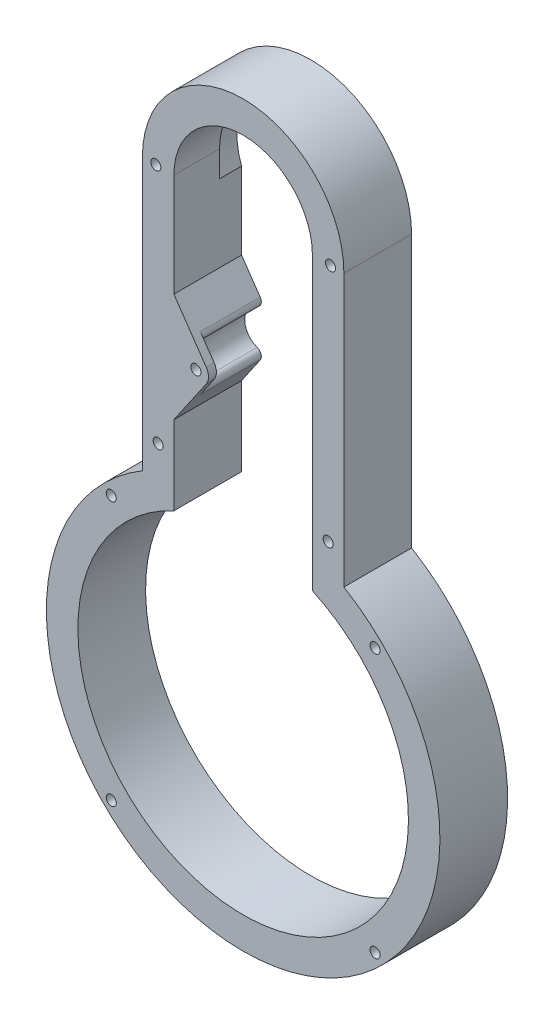
ISO-10303-21;
HEADER;
FILE_DESCRIPTION(('STEP AP214'),'2;1');
FILE_NAME('part.step','',(''),(''),'','','');
FILE_SCHEMA(('AUTOMOTIVE_DESIGN { 1 0 10303 214 1 1 1 1 }'));
ENDSEC;
DATA;
#1=APPLICATION_CONTEXT('core data for automotive mechanical design processes');
#2=APPLICATION_PROTOCOL_DEFINITION('international standard','automotive_design',2000,#1);
#3=PRODUCT_CONTEXT('',#1,'mechanical');
#4=PRODUCT('Part','Part','',(#3));
#5=PRODUCT_RELATED_PRODUCT_CATEGORY('part','',(#4));
#6=PRODUCT_DEFINITION_FORMATION('','',#4);
#7=PRODUCT_DEFINITION_CONTEXT('part definition',#1,'design');
#8=PRODUCT_DEFINITION('design','',#6,#7);
#9=PRODUCT_DEFINITION_SHAPE('','',#8);
#10=(LENGTH_UNIT() NAMED_UNIT(*) SI_UNIT(.MILLI.,.METRE.));
#11=(NAMED_UNIT(*) PLANE_ANGLE_UNIT() SI_UNIT($,.RADIAN.));
#12=(NAMED_UNIT(*) SI_UNIT($,.STERADIAN.) SOLID_ANGLE_UNIT());
#13=UNCERTAINTY_MEASURE_WITH_UNIT(LENGTH_MEASURE(1.E-05),#10,'distance_accuracy_value','');
#14=(GEOMETRIC_REPRESENTATION_CONTEXT(3) GLOBAL_UNCERTAINTY_ASSIGNED_CONTEXT((#13)) GLOBAL_UNIT_ASSIGNED_CONTEXT((#10,
#11,#12)) REPRESENTATION_CONTEXT('',''));
#15=CARTESIAN_POINT('',(0.,0.,0.));
#16=DIRECTION('',(0.,0.,1.));
#17=DIRECTION('',(1.,0.,0.));
#18=AXIS2_PLACEMENT_3D('',#15,#16,#17);
#19=CARTESIAN_POINT('',(-22.0000000000008,-132.331876479146,287.235300628274));
#20=DIRECTION('',(1.,0.,0.));
#21=DIRECTION('',(0.,1.,0.));
#22=AXIS2_PLACEMENT_3D('',#19,#20,#21);
#23=PLANE('',#22);
#24=DIRECTION('',(0.,-1.,0.));
#25=VECTOR('',#24,1.);
#26=CARTESIAN_POINT('',(-22.0000000000008,-132.331876479146,0.));
#27=LINE('',#26,#25);
#28=CARTESIAN_POINT('',(-22.0000000000008,-107.263903455659,0.));
#29=VERTEX_POINT('',#28);
#30=CARTESIAN_POINT('',(-22.0000000000008,-132.331876479147,0.));
#31=VERTEX_POINT('',#30);
#32=EDGE_CURVE('E190',#29,#31,#27,.T.);
#33=ORIENTED_EDGE('',*,*,#32,.F.);
#34=DIRECTION('',(0.,0.,1.));
#35=VECTOR('',#34,1.);
#36=CARTESIAN_POINT('',(-22.0000000000008,-107.263903455659,-36.2376799768453));
#37=LINE('',#36,#35);
#38=CARTESIAN_POINT('',(-22.0000000000008,-107.263903455659,21.4999999999996));
#39=VERTEX_POINT('',#38);
#40=EDGE_CURVE('E300',#29,#39,#37,.T.);
#41=ORIENTED_EDGE('',*,*,#40,.T.);
#42=DIRECTION('',(0.,1.,0.));
#43=VECTOR('',#42,1.);
#44=CARTESIAN_POINT('',(-22.0000000000008,-132.331876479146,21.4999999999995));
#45=LINE('',#44,#43);
#46=CARTESIAN_POINT('',(-22.0000000000008,-132.331876479146,21.4999999999994));
#47=VERTEX_POINT('',#46);
#48=EDGE_CURVE('E236',#47,#39,#45,.T.);
#49=ORIENTED_EDGE('',*,*,#48,.F.);
#50=DIRECTION('',(0.,0.,-1.));
#51=VECTOR('',#50,1.);
#52=CARTESIAN_POINT('',(-22.0000000000008,-132.331876479147,287.235300628274));
#53=LINE('',#52,#51);
#54=EDGE_CURVE('E219',#47,#31,#53,.T.);
#55=ORIENTED_EDGE('',*,*,#54,.T.);
#56=EDGE_LOOP('',(#33,#41,#49,#55));
#57=FACE_BOUND('',#56,.T.);
#58=ADVANCED_FACE('F41',(#57),#23,.T.);
#59=CARTESIAN_POINT('',(-8.38206200899663E-13,-180.000000000007,0.));
#60=DIRECTION('',(0.,0.,1.));
#61=DIRECTION('',(1.,0.,0.));
#62=AXIS2_PLACEMENT_3D('',#59,#60,#61);
#63=PLANE('',#62);
#64=CARTESIAN_POINT('',(-27.0000000000008,-116.313409495487,0.));
#65=DIRECTION('',(0.,0.,-1.));
#66=DIRECTION('',(-1.,0.,0.));
#67=AXIS2_PLACEMENT_3D('',#64,#65,#66);
#68=CIRCLE('',#67,1.60000000000001);
#69=CARTESIAN_POINT('',(-28.6000000000009,-116.313409495487,0.));
#70=VERTEX_POINT('',#69);
#71=EDGE_CURVE('E560',#70,#70,#68,.T.);
#72=ORIENTED_EDGE('',*,*,#71,.F.);
#73=EDGE_LOOP('',(#72));
#74=FACE_BOUND('',#73,.T.);
#75=CARTESIAN_POINT('',(27.7500000000008,-40.0000000000076,0.));
#76=DIRECTION('',(0.,0.,-1.));
#77=DIRECTION('',(1.,0.,0.));
#78=AXIS2_PLACEMENT_3D('',#75,#76,#77);
#79=CIRCLE('',#78,1.60000000000009);
#80=CARTESIAN_POINT('',(29.3500000000008,-40.0000000000076,0.));
#81=VERTEX_POINT('',#80);
#82=EDGE_CURVE('E566',#81,#81,#79,.T.);
#83=ORIENTED_EDGE('',*,*,#82,.F.);
#84=EDGE_LOOP('',(#83));
#85=FACE_BOUND('',#84,.T.);
#86=CARTESIAN_POINT('',(27.0000000000008,-116.313409495487,0.));
#87=DIRECTION('',(0.,0.,-1.));
#88=DIRECTION('',(1.,0.,0.));
#89=AXIS2_PLACEMENT_3D('',#86,#87,#88);
#90=CIRCLE('',#89,1.60000000000001);
#91=CARTESIAN_POINT('',(28.6000000000008,-116.313409495487,0.));
#92=VERTEX_POINT('',#91);
#93=EDGE_CURVE('E577',#92,#92,#90,.T.);
#94=ORIENTED_EDGE('',*,*,#93,.F.);
#95=EDGE_LOOP('',(#94));
#96=FACE_BOUND('',#95,.T.);
#97=CARTESIAN_POINT('',(-27.7500000000008,-40.0000000000076,0.));
#98=DIRECTION('',(0.,0.,-1.));
#99=DIRECTION('',(-1.,0.,0.));
#100=AXIS2_PLACEMENT_3D('',#97,#98,#99);
#101=CIRCLE('',#100,1.60000000000008);
#102=CARTESIAN_POINT('',(-29.3500000000008,-40.0000000000076,0.));
#103=VERTEX_POINT('',#102);
#104=EDGE_CURVE('E561',#103,#103,#101,.T.);
#105=ORIENTED_EDGE('',*,*,#104,.F.);
#106=EDGE_LOOP('',(#105));
#107=FACE_BOUND('',#106,.T.);
#108=CARTESIAN_POINT('',(-41.8960767853039,-138.103923214704,0.));
#109=DIRECTION('',(0.,0.,-1.));
#110=DIRECTION('',(-1.,0.,0.));
#111=AXIS2_PLACEMENT_3D('',#108,#109,#110);
#112=CIRCLE('',#111,1.59999999999988);
#113=CARTESIAN_POINT('',(-43.4960767853038,-138.103923214704,0.));
#114=VERTEX_POINT('',#113);
#115=EDGE_CURVE('E594',#114,#114,#112,.T.);
#116=ORIENTED_EDGE('',*,*,#115,.F.);
#117=EDGE_LOOP('',(#116));
#118=FACE_BOUND('',#117,.T.);
#119=CARTESIAN_POINT('',(41.8960767853019,-138.103923214704,0.));
#120=DIRECTION('',(0.,0.,-1.));
#121=DIRECTION('',(-1.,0.,0.));
#122=AXIS2_PLACEMENT_3D('',#119,#120,#121);
#123=CIRCLE('',#122,1.59999999999983);
#124=CARTESIAN_POINT('',(40.2960767853021,-138.103923214704,0.));
#125=VERTEX_POINT('',#124);
#126=EDGE_CURVE('E588',#125,#125,#123,.T.);
#127=ORIENTED_EDGE('',*,*,#126,.F.);
#128=EDGE_LOOP('',(#127));
#129=FACE_BOUND('',#128,.T.);
#130=CARTESIAN_POINT('',(41.896076785302,-221.89607678531,0.));
#131=DIRECTION('',(0.,0.,-1.));
#132=DIRECTION('',(-1.,0.,0.));
#133=AXIS2_PLACEMENT_3D('',#130,#131,#132);
#134=CIRCLE('',#133,1.59999999999994);
#135=CARTESIAN_POINT('',(40.296076785302,-221.89607678531,0.));
#136=VERTEX_POINT('',#135);
#137=EDGE_CURVE('E581',#136,#136,#134,.T.);
#138=ORIENTED_EDGE('',*,*,#137,.F.);
#139=EDGE_LOOP('',(#138));
#140=FACE_BOUND('',#139,.T.);
#141=CARTESIAN_POINT('',(-41.8960767853039,-221.89607678531,0.));
#142=DIRECTION('',(0.,0.,-1.));
#143=DIRECTION('',(-1.,0.,0.));
#144=AXIS2_PLACEMENT_3D('',#141,#142,#143);
#145=CIRCLE('',#144,1.59999999999997);
#146=CARTESIAN_POINT('',(-43.4960767853039,-221.89607678531,0.));
#147=VERTEX_POINT('',#146);
#148=EDGE_CURVE('E584',#147,#147,#145,.T.);
#149=ORIENTED_EDGE('',*,*,#148,.F.);
#150=EDGE_LOOP('',(#149));
#151=FACE_BOUND('',#150,.T.);
#152=CARTESIAN_POINT('',(-8.38206200899663E-13,-180.000000000007,0.));
#153=DIRECTION('',(0.,0.,1.));
#154=DIRECTION('',(1.,0.,0.));
#155=AXIS2_PLACEMENT_3D('',#152,#153,#154);
#156=CIRCLE('',#155,62.5);
#157=CARTESIAN_POINT('',(-32.0000000000008,-126.313409495487,0.));
#158=VERTEX_POINT('',#157);
#159=CARTESIAN_POINT('',(31.9999999999991,-126.313409495487,0.));
#160=VERTEX_POINT('',#159);
#161=EDGE_CURVE('E214',#158,#160,#156,.T.);
#162=ORIENTED_EDGE('',*,*,#161,.F.);
#163=DIRECTION('',(0.,-1.,0.));
#164=VECTOR('',#163,1.);
#165=CARTESIAN_POINT('',(-32.0000000000008,-126.313409495487,0.));
#166=LINE('',#165,#164);
#167=CARTESIAN_POINT('',(-32.0000000000008,-40.0000000000076,0.));
#168=VERTEX_POINT('',#167);
#169=EDGE_CURVE('E210',#168,#158,#166,.T.);
#170=ORIENTED_EDGE('',*,*,#169,.F.);
#171=CARTESIAN_POINT('',(-7.88993905312894E-13,-40.0000000000076,0.));
#172=DIRECTION('',(0.,0.,1.));
#173=DIRECTION('',(1.,0.,0.));
#174=AXIS2_PLACEMENT_3D('',#171,#172,#173);
#175=CIRCLE('',#174,32.);
#176=CARTESIAN_POINT('',(31.9999999999992,-40.0000000000076,0.));
#177=VERTEX_POINT('',#176);
#178=EDGE_CURVE('E206',#177,#168,#175,.T.);
#179=ORIENTED_EDGE('',*,*,#178,.F.);
#180=DIRECTION('',(0.,1.,0.));
#181=VECTOR('',#180,1.);
#182=CARTESIAN_POINT('',(31.9999999999991,-126.313409495487,0.));
#183=LINE('',#182,#181);
#184=EDGE_CURVE('E202',#160,#177,#183,.T.);
#185=ORIENTED_EDGE('',*,*,#184,.F.);
#186=EDGE_LOOP('',(#162,#170,#179,#185));
#187=FACE_BOUND('',#186,.T.);
#188=DIRECTION('',(0.,1.,0.));
#189=VECTOR('',#188,1.);
#190=CARTESIAN_POINT('',(21.9999999999991,-132.331876479146,0.));
#191=LINE('',#190,#189);
#192=CARTESIAN_POINT('',(21.9999999999991,-132.331876479146,0.));
#193=VERTEX_POINT('',#192);
#194=CARTESIAN_POINT('',(21.9999999999992,-48.2613558209038,0.));
#195=VERTEX_POINT('',#194);
#196=EDGE_CURVE('E181',#193,#195,#191,.T.);
#197=ORIENTED_EDGE('',*,*,#196,.T.);
#198=CARTESIAN_POINT('',(-6.62335602067315E-12,-40.0000000000068,0.));
#199=DIRECTION('',(0.,0.,-1.));
#200=DIRECTION('',(-1.,0.,0.));
#201=AXIS2_PLACEMENT_3D('',#198,#199,#200);
#202=CIRCLE('',#201,23.4999999999942);
#203=CARTESIAN_POINT('',(-22.0000000000008,-48.2613558209349,0.));
#204=VERTEX_POINT('',#203);
#205=EDGE_CURVE('E56',#204,#195,#202,.T.);
#206=ORIENTED_EDGE('',*,*,#205,.F.);
#207=CARTESIAN_POINT('',(-22.0000000000008,-72.7360965443561,0.));
#208=VERTEX_POINT('',#207);
#209=EDGE_CURVE('E177',#204,#208,#27,.T.);
#210=ORIENTED_EDGE('',*,*,#209,.T.);
#211=DIRECTION('',(0.565975863912896,-0.824421810402934,0.));
#212=VECTOR('',#211,1.);
#213=CARTESIAN_POINT('',(-48.8916387538416,-33.5647203077977,0.));
#214=LINE('',#213,#212);
#215=CARTESIAN_POINT('',(-16.0863429489682,-81.3501526604747,0.));
#216=VERTEX_POINT('',#215);
#217=EDGE_CURVE('E193',#208,#216,#214,.T.);
#218=ORIENTED_EDGE('',*,*,#217,.T.);
#219=CARTESIAN_POINT('',(-17.735186569774,-82.4821043883005,0.));
#220=DIRECTION('',(0.,0.,1.));
#221=DIRECTION('',(1.,0.,0.));
#222=AXIS2_PLACEMENT_3D('',#219,#220,#221);
#223=CIRCLE('',#222,2.);
#224=CARTESIAN_POINT('',(-17.0513899273305,-84.3615782912273,0.));
#225=VERTEX_POINT('',#224);
#226=EDGE_CURVE('E251',#216,#225,#223,.F.);
#227=ORIENTED_EDGE('',*,*,#226,.T.);
#228=CARTESIAN_POINT('',(-15.,-90.0000000000078,0.));
#229=DIRECTION('',(0.,0.,-1.));
#230=DIRECTION('',(-1.,0.,0.));
#231=AXIS2_PLACEMENT_3D('',#228,#229,#230);
#232=CIRCLE('',#231,6.);
#233=CARTESIAN_POINT('',(-17.0513899273306,-95.6384217087882,0.));
#234=VERTEX_POINT('',#233);
#235=EDGE_CURVE('E276',#234,#225,#232,.T.);
#236=ORIENTED_EDGE('',*,*,#235,.F.);
#237=CARTESIAN_POINT('',(-17.7351865697742,-97.517895611715,0.));
#238=DIRECTION('',(0.,0.,1.));
#239=DIRECTION('',(1.,0.,0.));
#240=AXIS2_PLACEMENT_3D('',#237,#238,#239);
#241=CIRCLE('',#240,2.);
#242=CARTESIAN_POINT('',(-16.0863429489683,-98.6498473395408,0.));
#243=VERTEX_POINT('',#242);
#244=EDGE_CURVE('E253',#234,#243,#241,.F.);
#245=ORIENTED_EDGE('',*,*,#244,.T.);
#246=DIRECTION('',(0.565975863912894,0.824421810402935,0.));
#247=VECTOR('',#246,1.);
#248=CARTESIAN_POINT('',(35.0968735930235,-24.0944418279578,0.));
#249=LINE('',#248,#247);
#250=EDGE_CURVE('E291',#29,#243,#249,.T.);
#251=ORIENTED_EDGE('',*,*,#250,.F.);
#252=ORIENTED_EDGE('',*,*,#32,.T.);
#253=CARTESIAN_POINT('',(-7.82933356390165E-13,-180.000000000006,0.));
#254=DIRECTION('',(0.,0.,1.));
#255=DIRECTION('',(1.,0.,0.));
#256=AXIS2_PLACEMENT_3D('',#253,#254,#255);
#257=CIRCLE('',#256,52.499999999999);
#258=EDGE_CURVE('E189',#31,#193,#257,.T.);
#259=ORIENTED_EDGE('',*,*,#258,.T.);
#260=EDGE_LOOP('',(#197,#206,#210,#218,#227,#236,#245,#251,#252,#259));
#261=FACE_BOUND('',#260,.T.);
#262=ADVANCED_FACE('F175',(#74,#85,#96,#107,#118,#129,#140,#151,#187,#261),#63,.F.);
#263=CARTESIAN_POINT('',(-8.38206200899663E-13,-180.000000000007,287.235300628274));
#264=DIRECTION('',(0.,0.,-1.));
#265=DIRECTION('',(-1.,0.,0.));
#266=AXIS2_PLACEMENT_3D('',#263,#264,#265);
#267=CYLINDRICAL_SURFACE('',#266,62.5);
#268=DIRECTION('',(0.,0.,-1.));
#269=VECTOR('',#268,1.);
#270=CARTESIAN_POINT('',(31.9999999999991,-126.313409495487,287.235300628274));
#271=LINE('',#270,#269);
#272=CARTESIAN_POINT('',(31.9999999999991,-126.313409495487,21.4999999999995));
#273=VERTEX_POINT('',#272);
#274=EDGE_CURVE('E200',#273,#160,#271,.T.);
#275=ORIENTED_EDGE('',*,*,#274,.F.);
#276=CARTESIAN_POINT('',(-8.38206200899663E-13,-180.000000000007,21.4999999999994));
#277=DIRECTION('',(0.,0.,-1.));
#278=DIRECTION('',(0.,1.,0.));
#279=AXIS2_PLACEMENT_3D('',#276,#277,#278);
#280=CIRCLE('',#279,62.5);
#281=CARTESIAN_POINT('',(-32.0000000000008,-126.313409495487,21.4999999999995));
#282=VERTEX_POINT('',#281);
#283=EDGE_CURVE('E215',#273,#282,#280,.T.);
#284=ORIENTED_EDGE('',*,*,#283,.T.);
#285=DIRECTION('',(0.,0.,-1.));
#286=VECTOR('',#285,1.);
#287=CARTESIAN_POINT('',(-32.0000000000008,-126.313409495487,287.235300628274));
#288=LINE('',#287,#286);
#289=EDGE_CURVE('E212',#282,#158,#288,.T.);
#290=ORIENTED_EDGE('',*,*,#289,.T.);
#291=ORIENTED_EDGE('',*,*,#161,.T.);
#292=EDGE_LOOP('',(#275,#284,#290,#291));
#293=FACE_BOUND('',#292,.T.);
#294=ADVANCED_FACE('F323',(#293),#267,.T.);
#295=CARTESIAN_POINT('',(31.9999999999991,-126.313409495487,287.235300628274));
#296=DIRECTION('',(-1.,0.,0.));
#297=DIRECTION('',(0.,-1.,0.));
#298=AXIS2_PLACEMENT_3D('',#295,#296,#297);
#299=PLANE('',#298);
#300=DIRECTION('',(0.,0.,-1.));
#301=VECTOR('',#300,1.);
#302=CARTESIAN_POINT('',(31.9999999999992,-40.0000000000076,287.235300628274));
#303=LINE('',#302,#301);
#304=CARTESIAN_POINT('',(31.9999999999992,-40.0000000000076,21.4999999999996));
#305=VERTEX_POINT('',#304);
#306=EDGE_CURVE('E204',#305,#177,#303,.T.);
#307=ORIENTED_EDGE('',*,*,#306,.F.);
#308=DIRECTION('',(0.,-1.,0.));
#309=VECTOR('',#308,1.);
#310=CARTESIAN_POINT('',(31.9999999999991,-126.313409495487,21.4999999999995));
#311=LINE('',#310,#309);
#312=EDGE_CURVE('E203',#305,#273,#311,.T.);
#313=ORIENTED_EDGE('',*,*,#312,.T.);
#314=ORIENTED_EDGE('',*,*,#274,.T.);
#315=ORIENTED_EDGE('',*,*,#184,.T.);
#316=EDGE_LOOP('',(#307,#313,#314,#315));
#317=FACE_BOUND('',#316,.T.);
#318=ADVANCED_FACE('F331',(#317),#299,.F.);
#319=CARTESIAN_POINT('',(-7.88993905312894E-13,-40.0000000000076,287.235300628274));
#320=DIRECTION('',(0.,0.,-1.));
#321=DIRECTION('',(-1.,0.,0.));
#322=AXIS2_PLACEMENT_3D('',#319,#320,#321);
#323=CYLINDRICAL_SURFACE('',#322,32.);
#324=DIRECTION('',(0.,0.,-1.));
#325=VECTOR('',#324,1.);
#326=CARTESIAN_POINT('',(-32.0000000000008,-40.0000000000076,287.235300628274));
#327=LINE('',#326,#325);
#328=CARTESIAN_POINT('',(-32.0000000000008,-40.0000000000076,21.4999999999995));
#329=VERTEX_POINT('',#328);
#330=EDGE_CURVE('E208',#329,#168,#327,.T.);
#331=ORIENTED_EDGE('',*,*,#330,.F.);
#332=CARTESIAN_POINT('',(-7.88993905312894E-13,-40.0000000000076,21.4999999999996));
#333=DIRECTION('',(0.,0.,-1.));
#334=DIRECTION('',(0.,1.,0.));
#335=AXIS2_PLACEMENT_3D('',#332,#333,#334);
#336=CIRCLE('',#335,32.);
#337=EDGE_CURVE('E207',#329,#305,#336,.T.);
#338=ORIENTED_EDGE('',*,*,#337,.T.);
#339=ORIENTED_EDGE('',*,*,#306,.T.);
#340=ORIENTED_EDGE('',*,*,#178,.T.);
#341=EDGE_LOOP('',(#331,#338,#339,#340));
#342=FACE_BOUND('',#341,.T.);
#343=ADVANCED_FACE('F339',(#342),#323,.T.);
#344=CARTESIAN_POINT('',(-32.0000000000008,-126.313409495487,287.235300628274));
#345=DIRECTION('',(1.,0.,0.));
#346=DIRECTION('',(0.,1.,0.));
#347=AXIS2_PLACEMENT_3D('',#344,#345,#346);
#348=PLANE('',#347);
#349=ORIENTED_EDGE('',*,*,#289,.F.);
#350=DIRECTION('',(0.,1.,0.));
#351=VECTOR('',#350,1.);
#352=CARTESIAN_POINT('',(-32.0000000000008,-126.313409495487,21.4999999999995));
#353=LINE('',#352,#351);
#354=EDGE_CURVE('E211',#282,#329,#353,.T.);
#355=ORIENTED_EDGE('',*,*,#354,.T.);
#356=ORIENTED_EDGE('',*,*,#330,.T.);
#357=ORIENTED_EDGE('',*,*,#169,.T.);
#358=EDGE_LOOP('',(#349,#355,#356,#357));
#359=FACE_BOUND('',#358,.T.);
#360=ADVANCED_FACE('F337',(#359),#348,.F.);
#361=CARTESIAN_POINT('',(-7.83065447428345E-13,-40.0000000000076,287.235300628274));
#362=DIRECTION('',(0.,0.,-1.));
#363=DIRECTION('',(-1.,0.,0.));
#364=AXIS2_PLACEMENT_3D('',#361,#362,#363);
#365=CYLINDRICAL_SURFACE('',#364,22.);
#366=CARTESIAN_POINT('',(-7.83065447428345E-13,-40.0000000000076,6.99999999999967));
#367=DIRECTION('',(0.,0.,1.));
#368=DIRECTION('',(1.,0.,0.));
#369=AXIS2_PLACEMENT_3D('',#366,#367,#368);
#370=CIRCLE('',#369,22.);
#371=CARTESIAN_POINT('',(21.9999999999992,-40.0000000000076,6.9999999999997));
#372=VERTEX_POINT('',#371);
#373=CARTESIAN_POINT('',(-22.0000000000008,-40.0000000000076,6.99999999999963));
#374=VERTEX_POINT('',#373);
#375=EDGE_CURVE('E171',#372,#374,#370,.T.);
#376=ORIENTED_EDGE('',*,*,#375,.F.);
#377=DIRECTION('',(0.,0.,-1.));
#378=VECTOR('',#377,1.);
#379=CARTESIAN_POINT('',(21.9999999999992,-40.0000000000076,287.235300628274));
#380=LINE('',#379,#378);
#381=CARTESIAN_POINT('',(21.9999999999992,-40.0000000000076,21.4999999999995));
#382=VERTEX_POINT('',#381);
#383=EDGE_CURVE('E224',#382,#372,#380,.T.);
#384=ORIENTED_EDGE('',*,*,#383,.F.);
#385=CARTESIAN_POINT('',(-7.83065447428345E-13,-40.0000000000076,21.4999999999996));
#386=DIRECTION('',(0.,0.,-1.));
#387=DIRECTION('',(0.,1.,0.));
#388=AXIS2_PLACEMENT_3D('',#385,#386,#387);
#389=CIRCLE('',#388,22.);
#390=CARTESIAN_POINT('',(-22.0000000000008,-40.0000000000076,21.4999999999996));
#391=VERTEX_POINT('',#390);
#392=EDGE_CURVE('E199',#391,#382,#389,.T.);
#393=ORIENTED_EDGE('',*,*,#392,.F.);
#394=DIRECTION('',(0.,0.,-1.));
#395=VECTOR('',#394,1.);
#396=CARTESIAN_POINT('',(-22.0000000000008,-40.0000000000076,287.235300628274));
#397=LINE('',#396,#395);
#398=EDGE_CURVE('E216',#391,#374,#397,.T.);
#399=ORIENTED_EDGE('',*,*,#398,.T.);
#400=EDGE_LOOP('',(#376,#384,#393,#399));
#401=FACE_BOUND('',#400,.T.);
#402=ADVANCED_FACE('F273',(#401),#365,.F.);
#403=DIRECTION('',(0.,-1.,0.));
#404=VECTOR('',#403,1.);
#405=CARTESIAN_POINT('',(-22.0000000000008,-132.331876479146,6.99999999999956));
#406=LINE('',#405,#404);
#407=CARTESIAN_POINT('',(-22.0000000000008,-48.2613558209349,6.99999999999961));
#408=VERTEX_POINT('',#407);
#409=EDGE_CURVE('E265',#374,#408,#406,.T.);
#410=ORIENTED_EDGE('',*,*,#409,.F.);
#411=ORIENTED_EDGE('',*,*,#398,.F.);
#412=CARTESIAN_POINT('',(-22.0000000000008,-72.7360965443561,21.4999999999995));
#413=VERTEX_POINT('',#412);
#414=EDGE_CURVE('E240',#413,#391,#45,.T.);
#415=ORIENTED_EDGE('',*,*,#414,.F.);
#416=DIRECTION('',(0.,0.,1.));
#417=VECTOR('',#416,1.);
#418=CARTESIAN_POINT('',(-22.0000000000008,-72.7360965443561,-36.2376799768453));
#419=LINE('',#418,#417);
#420=EDGE_CURVE('E188',#208,#413,#419,.T.);
#421=ORIENTED_EDGE('',*,*,#420,.F.);
#422=ORIENTED_EDGE('',*,*,#209,.F.);
#423=DIRECTION('',(0.,0.,-1.));
#424=VECTOR('',#423,1.);
#425=CARTESIAN_POINT('',(-22.0000000000008,-48.2613558209349,73.4680374315186));
#426=LINE('',#425,#424);
#427=EDGE_CURVE('E164',#408,#204,#426,.T.);
#428=ORIENTED_EDGE('',*,*,#427,.F.);
#429=EDGE_LOOP('',(#410,#411,#415,#421,#422,#428));
#430=FACE_BOUND('',#429,.T.);
#431=ADVANCED_FACE('F185',(#430),#23,.T.);
#432=CARTESIAN_POINT('',(-7.82933356390165E-13,-180.000000000006,287.235300628274));
#433=DIRECTION('',(0.,0.,-1.));
#434=DIRECTION('',(-1.,0.,0.));
#435=AXIS2_PLACEMENT_3D('',#432,#433,#434);
#436=CYLINDRICAL_SURFACE('',#435,52.499999999999);
#437=CARTESIAN_POINT('',(-7.82933356390165E-13,-180.000000000006,21.4999999999994));
#438=DIRECTION('',(0.,0.,-1.));
#439=DIRECTION('',(0.,1.,0.));
#440=AXIS2_PLACEMENT_3D('',#437,#438,#439);
#441=CIRCLE('',#440,52.499999999999);
#442=CARTESIAN_POINT('',(21.9999999999991,-132.331876479146,21.4999999999995));
#443=VERTEX_POINT('',#442);
#444=EDGE_CURVE('E198',#443,#47,#441,.T.);
#445=ORIENTED_EDGE('',*,*,#444,.F.);
#446=DIRECTION('',(0.,0.,-1.));
#447=VECTOR('',#446,1.);
#448=CARTESIAN_POINT('',(21.9999999999991,-132.331876479146,287.235300628274));
#449=LINE('',#448,#447);
#450=EDGE_CURVE('E222',#443,#193,#449,.T.);
#451=ORIENTED_EDGE('',*,*,#450,.T.);
#452=ORIENTED_EDGE('',*,*,#258,.F.);
#453=ORIENTED_EDGE('',*,*,#54,.F.);
#454=EDGE_LOOP('',(#445,#451,#452,#453));
#455=FACE_BOUND('',#454,.T.);
#456=ADVANCED_FACE('F362',(#455),#436,.F.);
#457=CARTESIAN_POINT('',(21.9999999999991,-132.331876479146,287.235300628274));
#458=DIRECTION('',(-1.,0.,0.));
#459=DIRECTION('',(0.,-1.,0.));
#460=AXIS2_PLACEMENT_3D('',#457,#458,#459);
#461=PLANE('',#460);
#462=DIRECTION('',(0.,1.,0.));
#463=VECTOR('',#462,1.);
#464=CARTESIAN_POINT('',(21.9999999999991,-132.331876479146,6.99999999999962));
#465=LINE('',#464,#463);
#466=CARTESIAN_POINT('',(21.9999999999992,-48.2613558209038,6.99999999999969));
#467=VERTEX_POINT('',#466);
#468=EDGE_CURVE('E11',#467,#372,#465,.T.);
#469=ORIENTED_EDGE('',*,*,#468,.F.);
#470=DIRECTION('',(0.,0.,-1.));
#471=VECTOR('',#470,1.);
#472=CARTESIAN_POINT('',(21.9999999999992,-48.2613558209038,73.4680374315186));
#473=LINE('',#472,#471);
#474=EDGE_CURVE('E49',#195,#467,#473,.F.);
#475=ORIENTED_EDGE('',*,*,#474,.F.);
#476=ORIENTED_EDGE('',*,*,#196,.F.);
#477=ORIENTED_EDGE('',*,*,#450,.F.);
#478=DIRECTION('',(0.,-1.,0.));
#479=VECTOR('',#478,1.);
#480=CARTESIAN_POINT('',(21.9999999999991,-132.331876479146,21.4999999999995));
#481=LINE('',#480,#479);
#482=EDGE_CURVE('E196',#382,#443,#481,.T.);
#483=ORIENTED_EDGE('',*,*,#482,.F.);
#484=ORIENTED_EDGE('',*,*,#383,.T.);
#485=EDGE_LOOP('',(#469,#475,#476,#477,#483,#484));
#486=FACE_BOUND('',#485,.T.);
#487=ADVANCED_FACE('F267',(#486),#461,.T.);
#488=CARTESIAN_POINT('',(-44.1941738241602,-224.194173824166,21.4999999999993));
#489=DIRECTION('',(0.,0.,-1.));
#490=DIRECTION('',(0.707106781186547,-0.707106781186548,0.));
#491=AXIS2_PLACEMENT_3D('',#488,#489,#490);
#492=PLANE('',#491);
#493=CARTESIAN_POINT('',(-27.0000000000008,-116.313409495487,21.4999999999996));
#494=DIRECTION('',(0.,0.,-1.));
#495=DIRECTION('',(-1.,0.,0.));
#496=AXIS2_PLACEMENT_3D('',#493,#494,#495);
#497=CIRCLE('',#496,1.60000000000001);
#498=CARTESIAN_POINT('',(-28.6000000000009,-116.313409495487,21.4999999999996));
#499=VERTEX_POINT('',#498);
#500=EDGE_CURVE('E557',#499,#499,#497,.T.);
#501=ORIENTED_EDGE('',*,*,#500,.T.);
#502=EDGE_LOOP('',(#501));
#503=FACE_BOUND('',#502,.T.);
#504=CARTESIAN_POINT('',(27.7500000000008,-40.0000000000076,21.4999999999996));
#505=DIRECTION('',(0.,0.,-1.));
#506=DIRECTION('',(1.,0.,0.));
#507=AXIS2_PLACEMENT_3D('',#504,#505,#506);
#508=CIRCLE('',#507,1.60000000000009);
#509=CARTESIAN_POINT('',(29.3500000000008,-40.0000000000076,21.4999999999996));
#510=VERTEX_POINT('',#509);
#511=EDGE_CURVE('E574',#510,#510,#508,.T.);
#512=ORIENTED_EDGE('',*,*,#511,.T.);
#513=EDGE_LOOP('',(#512));
#514=FACE_BOUND('',#513,.T.);
#515=CARTESIAN_POINT('',(27.0000000000008,-116.313409495487,21.4999999999996));
#516=DIRECTION('',(0.,0.,-1.));
#517=DIRECTION('',(1.,0.,0.));
#518=AXIS2_PLACEMENT_3D('',#515,#516,#517);
#519=CIRCLE('',#518,1.60000000000001);
#520=CARTESIAN_POINT('',(28.6000000000008,-116.313409495487,21.4999999999996));
#521=VERTEX_POINT('',#520);
#522=EDGE_CURVE('E569',#521,#521,#519,.T.);
#523=ORIENTED_EDGE('',*,*,#522,.T.);
#524=EDGE_LOOP('',(#523));
#525=FACE_BOUND('',#524,.T.);
#526=CARTESIAN_POINT('',(-27.7500000000008,-40.0000000000076,21.4999999999996));
#527=DIRECTION('',(0.,0.,-1.));
#528=DIRECTION('',(-1.,0.,0.));
#529=AXIS2_PLACEMENT_3D('',#526,#527,#528);
#530=CIRCLE('',#529,1.60000000000008);
#531=CARTESIAN_POINT('',(-29.3500000000008,-40.0000000000076,21.4999999999996));
#532=VERTEX_POINT('',#531);
#533=EDGE_CURVE('E564',#532,#532,#530,.T.);
#534=ORIENTED_EDGE('',*,*,#533,.T.);
#535=EDGE_LOOP('',(#534));
#536=FACE_BOUND('',#535,.T.);
#537=CARTESIAN_POINT('',(-41.8960767853039,-138.103923214704,21.4999999999996));
#538=DIRECTION('',(0.,0.,-1.));
#539=DIRECTION('',(-1.,0.,0.));
#540=AXIS2_PLACEMENT_3D('',#537,#538,#539);
#541=CIRCLE('',#540,1.59999999999988);
#542=CARTESIAN_POINT('',(-43.4960767853038,-138.103923214704,21.4999999999996));
#543=VERTEX_POINT('',#542);
#544=EDGE_CURVE('E579',#543,#543,#541,.T.);
#545=ORIENTED_EDGE('',*,*,#544,.T.);
#546=EDGE_LOOP('',(#545));
#547=FACE_BOUND('',#546,.T.);
#548=CARTESIAN_POINT('',(41.8960767853019,-138.103923214704,21.4999999999996));
#549=DIRECTION('',(0.,0.,-1.));
#550=DIRECTION('',(-1.,0.,0.));
#551=AXIS2_PLACEMENT_3D('',#548,#549,#550);
#552=CIRCLE('',#551,1.59999999999983);
#553=CARTESIAN_POINT('',(40.2960767853021,-138.103923214704,21.4999999999996));
#554=VERTEX_POINT('',#553);
#555=EDGE_CURVE('E591',#554,#554,#552,.T.);
#556=ORIENTED_EDGE('',*,*,#555,.T.);
#557=EDGE_LOOP('',(#556));
#558=FACE_BOUND('',#557,.T.);
#559=CARTESIAN_POINT('',(41.896076785302,-221.89607678531,21.4999999999996));
#560=DIRECTION('',(0.,0.,-1.));
#561=DIRECTION('',(-1.,0.,0.));
#562=AXIS2_PLACEMENT_3D('',#559,#560,#561);
#563=CIRCLE('',#562,1.59999999999994);
#564=CARTESIAN_POINT('',(40.296076785302,-221.89607678531,21.4999999999996));
#565=VERTEX_POINT('',#564);
#566=EDGE_CURVE('E585',#565,#565,#563,.T.);
#567=ORIENTED_EDGE('',*,*,#566,.T.);
#568=EDGE_LOOP('',(#567));
#569=FACE_BOUND('',#568,.T.);
#570=CARTESIAN_POINT('',(-41.8960767853039,-221.89607678531,21.4999999999996));
#571=DIRECTION('',(0.,0.,-1.));
#572=DIRECTION('',(-1.,0.,0.));
#573=AXIS2_PLACEMENT_3D('',#570,#571,#572);
#574=CIRCLE('',#573,1.59999999999997);
#575=CARTESIAN_POINT('',(-43.4960767853039,-221.89607678531,21.4999999999996));
#576=VERTEX_POINT('',#575);
#577=EDGE_CURVE('E182',#576,#576,#574,.T.);
#578=ORIENTED_EDGE('',*,*,#577,.T.);
#579=EDGE_LOOP('',(#578));
#580=FACE_BOUND('',#579,.T.);
#581=ORIENTED_EDGE('',*,*,#392,.T.);
#582=ORIENTED_EDGE('',*,*,#482,.T.);
#583=ORIENTED_EDGE('',*,*,#444,.T.);
#584=ORIENTED_EDGE('',*,*,#48,.T.);
#585=DIRECTION('',(-0.565975863912895,-0.824421810402935,0.));
#586=VECTOR('',#585,1.);
#587=CARTESIAN_POINT('',(35.0968735930235,-24.0944418279578,21.4999999999996));
#588=LINE('',#587,#586);
#589=CARTESIAN_POINT('',(-11.7023127583883,-92.2639034556592,21.4999999999996));
#590=VERTEX_POINT('',#589);
#591=EDGE_CURVE('E298',#590,#39,#588,.T.);
#592=ORIENTED_EDGE('',*,*,#591,.F.);
#593=CARTESIAN_POINT('',(-15.,-90.0000000000076,21.4999999999996));
#594=DIRECTION('',(0.,0.,1.));
#595=DIRECTION('',(1.,0.,0.));
#596=AXIS2_PLACEMENT_3D('',#593,#594,#595);
#597=CIRCLE('',#596,4.00000000000001);
#598=CARTESIAN_POINT('',(-11.7023127583883,-87.736096544356,21.4999999999996));
#599=VERTEX_POINT('',#598);
#600=EDGE_CURVE('E294',#590,#599,#597,.T.);
#601=ORIENTED_EDGE('',*,*,#600,.T.);
#602=DIRECTION('',(-0.565975863912896,0.824421810402934,0.));
#603=VECTOR('',#602,1.);
#604=CARTESIAN_POINT('',(-48.8916387538416,-33.5647203077977,21.4999999999996));
#605=LINE('',#604,#603);
#606=EDGE_CURVE('E292',#599,#413,#605,.T.);
#607=ORIENTED_EDGE('',*,*,#606,.T.);
#608=ORIENTED_EDGE('',*,*,#414,.T.);
#609=EDGE_LOOP('',(#581,#582,#583,#584,#592,#601,#607,#608));
#610=FACE_BOUND('',#609,.T.);
#611=ORIENTED_EDGE('',*,*,#312,.F.);
#612=ORIENTED_EDGE('',*,*,#337,.F.);
#613=ORIENTED_EDGE('',*,*,#354,.F.);
#614=ORIENTED_EDGE('',*,*,#283,.F.);
#615=EDGE_LOOP('',(#611,#612,#613,#614));
#616=FACE_BOUND('',#615,.T.);
#617=CARTESIAN_POINT('',(-15.,-90.0000000000076,21.4999999999996));
#618=DIRECTION('',(0.,0.,1.));
#619=DIRECTION('',(1.,0.,0.));
#620=AXIS2_PLACEMENT_3D('',#617,#618,#619);
#621=CIRCLE('',#620,1.6);
#622=CARTESIAN_POINT('',(-13.4,-90.0000000000076,21.4999999999996));
#623=VERTEX_POINT('',#622);
#624=EDGE_CURVE('E302',#623,#623,#621,.T.);
#625=ORIENTED_EDGE('',*,*,#624,.F.);
#626=EDGE_LOOP('',(#625));
#627=FACE_BOUND('',#626,.T.);
#628=ADVANCED_FACE('F333',(#503,#514,#525,#536,#547,#558,#569,#580,#610,#616,#627),#492,.F.);
#629=CARTESIAN_POINT('',(35.0968735930235,-24.0944418279578,-36.2376799768453));
#630=DIRECTION('',(-0.824421810402935,0.565975863912894,0.));
#631=DIRECTION('',(-0.565975863912894,-0.824421810402935,0.));
#632=AXIS2_PLACEMENT_3D('',#629,#630,#631);
#633=PLANE('',#632);
#634=ORIENTED_EDGE('',*,*,#250,.T.);
#635=DIRECTION('',(0.,0.,-1.));
#636=VECTOR('',#635,1.);
#637=CARTESIAN_POINT('',(-16.0863429489683,-98.6498473395408,-36.2376799768453));
#638=LINE('',#637,#636);
#639=CARTESIAN_POINT('',(-16.0863429489683,-98.6498473395408,19.));
#640=VERTEX_POINT('',#639);
#641=EDGE_CURVE('E243',#243,#640,#638,.F.);
#642=ORIENTED_EDGE('',*,*,#641,.T.);
#643=DIRECTION('',(0.565975863912894,0.824421810402935,0.));
#644=VECTOR('',#643,1.);
#645=CARTESIAN_POINT('',(35.0968735930234,-24.0944418279579,19.0000000000003));
#646=LINE('',#645,#644);
#647=CARTESIAN_POINT('',(-11.7023127583883,-92.2639034556592,19.0000000000001));
#648=VERTEX_POINT('',#647);
#649=EDGE_CURVE('E285',#640,#648,#646,.T.);
#650=ORIENTED_EDGE('',*,*,#649,.T.);
#651=DIRECTION('',(0.,0.,1.));
#652=VECTOR('',#651,1.);
#653=CARTESIAN_POINT('',(-11.7023127583883,-92.2639034556592,-36.2376799768453));
#654=LINE('',#653,#652);
#655=EDGE_CURVE('E301',#648,#590,#654,.T.);
#656=ORIENTED_EDGE('',*,*,#655,.T.);
#657=ORIENTED_EDGE('',*,*,#591,.T.);
#658=ORIENTED_EDGE('',*,*,#40,.F.);
#659=EDGE_LOOP('',(#634,#642,#650,#656,#657,#658));
#660=FACE_BOUND('',#659,.T.);
#661=ADVANCED_FACE('F373',(#660),#633,.F.);
#662=CARTESIAN_POINT('',(-48.8916387538416,-33.5647203077977,-36.2376799768453));
#663=DIRECTION('',(0.824421810402934,0.565975863912896,0.));
#664=DIRECTION('',(-0.565975863912896,0.824421810402934,0.));
#665=AXIS2_PLACEMENT_3D('',#662,#663,#664);
#666=PLANE('',#665);
#667=DIRECTION('',(0.565975863912896,-0.824421810402934,0.));
#668=VECTOR('',#667,1.);
#669=CARTESIAN_POINT('',(-48.8916387538415,-33.5647203077979,19.0000000000004));
#670=LINE('',#669,#668);
#671=CARTESIAN_POINT('',(-16.0863429489682,-81.3501526604747,19.0000000000001));
#672=VERTEX_POINT('',#671);
#673=CARTESIAN_POINT('',(-11.7023127583883,-87.736096544356,19.0000000000001));
#674=VERTEX_POINT('',#673);
#675=EDGE_CURVE('E64',#672,#674,#670,.T.);
#676=ORIENTED_EDGE('',*,*,#675,.F.);
#677=DIRECTION('',(0.,0.,1.));
#678=VECTOR('',#677,1.);
#679=CARTESIAN_POINT('',(-16.0863429489682,-81.3501526604747,0.));
#680=LINE('',#679,#678);
#681=EDGE_CURVE('E255',#672,#216,#680,.F.);
#682=ORIENTED_EDGE('',*,*,#681,.T.);
#683=ORIENTED_EDGE('',*,*,#217,.F.);
#684=ORIENTED_EDGE('',*,*,#420,.T.);
#685=ORIENTED_EDGE('',*,*,#606,.F.);
#686=DIRECTION('',(0.,0.,1.));
#687=VECTOR('',#686,1.);
#688=CARTESIAN_POINT('',(-11.7023127583883,-87.736096544356,-36.2376799768453));
#689=LINE('',#688,#687);
#690=EDGE_CURVE('E297',#674,#599,#689,.T.);
#691=ORIENTED_EDGE('',*,*,#690,.F.);
#692=EDGE_LOOP('',(#676,#682,#683,#684,#685,#691));
#693=FACE_BOUND('',#692,.T.);
#694=ADVANCED_FACE('F401',(#693),#666,.T.);
#695=CARTESIAN_POINT('',(-15.,-90.0000000000076,-36.2376799768453));
#696=DIRECTION('',(0.,0.,1.));
#697=DIRECTION('',(1.,0.,0.));
#698=AXIS2_PLACEMENT_3D('',#695,#696,#697);
#699=CYLINDRICAL_SURFACE('',#698,1.6);
#700=CARTESIAN_POINT('',(-15.,-90.0000000000076,19.0000000000001));
#701=DIRECTION('',(0.,0.,1.));
#702=DIRECTION('',(0.,-1.,0.));
#703=AXIS2_PLACEMENT_3D('',#700,#701,#702);
#704=CIRCLE('',#703,1.6);
#705=CARTESIAN_POINT('',(-15.,-91.6000000000076,19.0000000000001));
#706=VERTEX_POINT('',#705);
#707=EDGE_CURVE('E288',#706,#706,#704,.F.);
#708=ORIENTED_EDGE('',*,*,#707,.T.);
#709=EDGE_LOOP('',(#708));
#710=FACE_BOUND('',#709,.T.);
#711=ORIENTED_EDGE('',*,*,#624,.T.);
#712=EDGE_LOOP('',(#711));
#713=FACE_BOUND('',#712,.T.);
#714=ADVANCED_FACE('F413',(#710,#713),#699,.F.);
#715=CARTESIAN_POINT('',(-15.,-90.0000000000076,-36.2376799768453));
#716=DIRECTION('',(0.,0.,1.));
#717=DIRECTION('',(1.,0.,0.));
#718=AXIS2_PLACEMENT_3D('',#715,#716,#717);
#719=CYLINDRICAL_SURFACE('',#718,4.00000000000001);
#720=CARTESIAN_POINT('',(-15.,-90.0000000000076,19.0000000000001));
#721=DIRECTION('',(0.,0.,1.));
#722=DIRECTION('',(0.,-1.,0.));
#723=AXIS2_PLACEMENT_3D('',#720,#721,#722);
#724=CIRCLE('',#723,4.00000000000001);
#725=EDGE_CURVE('E239',#674,#648,#724,.F.);
#726=ORIENTED_EDGE('',*,*,#725,.F.);
#727=ORIENTED_EDGE('',*,*,#690,.T.);
#728=ORIENTED_EDGE('',*,*,#600,.F.);
#729=ORIENTED_EDGE('',*,*,#655,.F.);
#730=EDGE_LOOP('',(#726,#727,#728,#729));
#731=FACE_BOUND('',#730,.T.);
#732=ADVANCED_FACE('F411',(#731),#719,.T.);
#733=CARTESIAN_POINT('',(-15.,-90.0000000000078,36.4705627484772));
#734=DIRECTION('',(0.,0.,-1.));
#735=DIRECTION('',(-1.,0.,0.));
#736=AXIS2_PLACEMENT_3D('',#733,#734,#735);
#737=CYLINDRICAL_SURFACE('',#736,6.);
#738=CARTESIAN_POINT('',(-15.,-90.0000000000078,19.0000000000001));
#739=DIRECTION('',(0.,0.,1.));
#740=DIRECTION('',(0.,-1.,0.));
#741=AXIS2_PLACEMENT_3D('',#738,#739,#740);
#742=CIRCLE('',#741,6.);
#743=CARTESIAN_POINT('',(-17.0513899273306,-95.6384217087882,19.0000000000001));
#744=VERTEX_POINT('',#743);
#745=CARTESIAN_POINT('',(-17.0513899273305,-84.3615782912273,19.0000000000001));
#746=VERTEX_POINT('',#745);
#747=EDGE_CURVE('E281',#744,#746,#742,.F.);
#748=ORIENTED_EDGE('',*,*,#747,.F.);
#749=DIRECTION('',(0.,0.,-1.));
#750=VECTOR('',#749,1.);
#751=CARTESIAN_POINT('',(-17.0513899273306,-95.6384217087882,36.4705627484772));
#752=LINE('',#751,#750);
#753=EDGE_CURVE('E249',#744,#234,#752,.T.);
#754=ORIENTED_EDGE('',*,*,#753,.T.);
#755=ORIENTED_EDGE('',*,*,#235,.T.);
#756=DIRECTION('',(0.,0.,-1.));
#757=VECTOR('',#756,1.);
#758=CARTESIAN_POINT('',(-17.0513899273305,-84.3615782912273,36.4705627484772));
#759=LINE('',#758,#757);
#760=EDGE_CURVE('E246',#225,#746,#759,.F.);
#761=ORIENTED_EDGE('',*,*,#760,.T.);
#762=EDGE_LOOP('',(#748,#754,#755,#761));
#763=FACE_BOUND('',#762,.T.);
#764=ADVANCED_FACE('F383',(#763),#737,.F.);
#765=CARTESIAN_POINT('',(-17.9437822430251,-91.8931841182724,19.0000000000001));
#766=DIRECTION('',(0.,0.,1.));
#767=DIRECTION('',(-0.540909748075568,0.841080640864374,0.));
#768=AXIS2_PLACEMENT_3D('',#765,#766,#767);
#769=PLANE('',#768);
#770=ORIENTED_EDGE('',*,*,#649,.F.);
#771=CARTESIAN_POINT('',(-17.7351865697742,-97.517895611715,19.0000000000001));
#772=DIRECTION('',(0.,0.,1.));
#773=DIRECTION('',(0.,-1.,0.));
#774=AXIS2_PLACEMENT_3D('',#771,#772,#773);
#775=CIRCLE('',#774,2.);
#776=EDGE_CURVE('E257',#640,#744,#775,.T.);
#777=ORIENTED_EDGE('',*,*,#776,.T.);
#778=ORIENTED_EDGE('',*,*,#747,.T.);
#779=CARTESIAN_POINT('',(-17.735186569774,-82.4821043883005,19.0000000000001));
#780=DIRECTION('',(0.,0.,1.));
#781=DIRECTION('',(0.,-1.,0.));
#782=AXIS2_PLACEMENT_3D('',#779,#780,#781);
#783=CIRCLE('',#782,2.);
#784=EDGE_CURVE('E259',#746,#672,#783,.T.);
#785=ORIENTED_EDGE('',*,*,#784,.T.);
#786=ORIENTED_EDGE('',*,*,#675,.T.);
#787=ORIENTED_EDGE('',*,*,#725,.T.);
#788=EDGE_LOOP('',(#770,#777,#778,#785,#786,#787));
#789=FACE_BOUND('',#788,.T.);
#790=ORIENTED_EDGE('',*,*,#707,.F.);
#791=EDGE_LOOP('',(#790));
#792=FACE_BOUND('',#791,.T.);
#793=ADVANCED_FACE('F377',(#789,#792),#769,.F.);
#794=CARTESIAN_POINT('',(-17.7351865697742,-97.517895611715,36.4705627484772));
#795=DIRECTION('',(0.,0.,-1.));
#796=DIRECTION('',(-1.,0.,0.));
#797=AXIS2_PLACEMENT_3D('',#794,#795,#796);
#798=CYLINDRICAL_SURFACE('',#797,2.);
#799=ORIENTED_EDGE('',*,*,#244,.F.);
#800=ORIENTED_EDGE('',*,*,#753,.F.);
#801=ORIENTED_EDGE('',*,*,#776,.F.);
#802=ORIENTED_EDGE('',*,*,#641,.F.);
#803=EDGE_LOOP('',(#799,#800,#801,#802));
#804=FACE_BOUND('',#803,.T.);
#805=ADVANCED_FACE('F375',(#804),#798,.T.);
#806=CARTESIAN_POINT('',(-17.735186569774,-82.4821043883005,36.4705627484772));
#807=DIRECTION('',(0.,0.,-1.));
#808=DIRECTION('',(-1.,0.,0.));
#809=AXIS2_PLACEMENT_3D('',#806,#807,#808);
#810=CYLINDRICAL_SURFACE('',#809,2.);
#811=ORIENTED_EDGE('',*,*,#226,.F.);
#812=ORIENTED_EDGE('',*,*,#681,.F.);
#813=ORIENTED_EDGE('',*,*,#784,.F.);
#814=ORIENTED_EDGE('',*,*,#760,.F.);
#815=EDGE_LOOP('',(#811,#812,#813,#814));
#816=FACE_BOUND('',#815,.T.);
#817=ADVANCED_FACE('F43',(#816),#810,.T.);
#818=CARTESIAN_POINT('',(11.0964438169459,-60.7151860869628,6.99999999999966));
#819=DIRECTION('',(0.,0.,1.));
#820=DIRECTION('',(-0.881497280296001,-0.472189098593723,0.));
#821=AXIS2_PLACEMENT_3D('',#818,#819,#820);
#822=PLANE('',#821);
#823=ORIENTED_EDGE('',*,*,#409,.T.);
#824=CARTESIAN_POINT('',(-6.62335602067315E-12,-40.0000000000068,6.99999999999966));
#825=DIRECTION('',(0.,0.,1.));
#826=DIRECTION('',(1.,0.,0.));
#827=AXIS2_PLACEMENT_3D('',#824,#825,#826);
#828=CIRCLE('',#827,23.4999999999942);
#829=EDGE_CURVE('E167',#408,#467,#828,.F.);
#830=ORIENTED_EDGE('',*,*,#829,.T.);
#831=ORIENTED_EDGE('',*,*,#468,.T.);
#832=ORIENTED_EDGE('',*,*,#375,.T.);
#833=EDGE_LOOP('',(#823,#830,#831,#832));
#834=FACE_BOUND('',#833,.T.);
#835=ADVANCED_FACE('F263',(#834),#822,.F.);
#836=CARTESIAN_POINT('',(-6.62335602067315E-12,-40.0000000000068,73.4680374315186));
#837=DIRECTION('',(0.,0.,-1.));
#838=DIRECTION('',(-1.,0.,0.));
#839=AXIS2_PLACEMENT_3D('',#836,#837,#838);
#840=CYLINDRICAL_SURFACE('',#839,23.4999999999942);
#841=ORIENTED_EDGE('',*,*,#427,.T.);
#842=ORIENTED_EDGE('',*,*,#205,.T.);
#843=ORIENTED_EDGE('',*,*,#474,.T.);
#844=ORIENTED_EDGE('',*,*,#829,.F.);
#845=EDGE_LOOP('',(#841,#842,#843,#844));
#846=FACE_BOUND('',#845,.T.);
#847=ADVANCED_FACE('F165',(#846),#840,.F.);
#848=CARTESIAN_POINT('',(-41.8960767853039,-221.89607678531,21.4999999999996));
#849=DIRECTION('',(0.,0.,-1.));
#850=DIRECTION('',(-1.,0.,0.));
#851=AXIS2_PLACEMENT_3D('',#848,#849,#850);
#852=CYLINDRICAL_SURFACE('',#851,1.59999999999997);
#853=ORIENTED_EDGE('',*,*,#577,.F.);
#854=EDGE_LOOP('',(#853));
#855=FACE_BOUND('',#854,.T.);
#856=ORIENTED_EDGE('',*,*,#148,.T.);
#857=EDGE_LOOP('',(#856));
#858=FACE_BOUND('',#857,.T.);
#859=ADVANCED_FACE('F472',(#855,#858),#852,.F.);
#860=CARTESIAN_POINT('',(41.896076785302,-221.89607678531,21.4999999999996));
#861=DIRECTION('',(0.,0.,-1.));
#862=DIRECTION('',(-1.,0.,0.));
#863=AXIS2_PLACEMENT_3D('',#860,#861,#862);
#864=CYLINDRICAL_SURFACE('',#863,1.59999999999994);
#865=ORIENTED_EDGE('',*,*,#566,.F.);
#866=EDGE_LOOP('',(#865));
#867=FACE_BOUND('',#866,.T.);
#868=ORIENTED_EDGE('',*,*,#137,.T.);
#869=EDGE_LOOP('',(#868));
#870=FACE_BOUND('',#869,.T.);
#871=ADVANCED_FACE('F481',(#867,#870),#864,.F.);
#872=CARTESIAN_POINT('',(41.8960767853019,-138.103923214704,21.4999999999996));
#873=DIRECTION('',(0.,0.,-1.));
#874=DIRECTION('',(-1.,0.,0.));
#875=AXIS2_PLACEMENT_3D('',#872,#873,#874);
#876=CYLINDRICAL_SURFACE('',#875,1.59999999999983);
#877=ORIENTED_EDGE('',*,*,#555,.F.);
#878=EDGE_LOOP('',(#877));
#879=FACE_BOUND('',#878,.T.);
#880=ORIENTED_EDGE('',*,*,#126,.T.);
#881=EDGE_LOOP('',(#880));
#882=FACE_BOUND('',#881,.T.);
#883=ADVANCED_FACE('F491',(#879,#882),#876,.F.);
#884=CARTESIAN_POINT('',(-41.8960767853039,-138.103923214704,21.4999999999996));
#885=DIRECTION('',(0.,0.,-1.));
#886=DIRECTION('',(-1.,0.,0.));
#887=AXIS2_PLACEMENT_3D('',#884,#885,#886);
#888=CYLINDRICAL_SURFACE('',#887,1.59999999999988);
#889=ORIENTED_EDGE('',*,*,#544,.F.);
#890=EDGE_LOOP('',(#889));
#891=FACE_BOUND('',#890,.T.);
#892=ORIENTED_EDGE('',*,*,#115,.T.);
#893=EDGE_LOOP('',(#892));
#894=FACE_BOUND('',#893,.T.);
#895=ADVANCED_FACE('F501',(#891,#894),#888,.F.);
#896=CARTESIAN_POINT('',(-27.7500000000008,-40.0000000000076,21.4999999999996));
#897=DIRECTION('',(0.,0.,-1.));
#898=DIRECTION('',(-1.,0.,0.));
#899=AXIS2_PLACEMENT_3D('',#896,#897,#898);
#900=CYLINDRICAL_SURFACE('',#899,1.60000000000008);
#901=ORIENTED_EDGE('',*,*,#533,.F.);
#902=EDGE_LOOP('',(#901));
#903=FACE_BOUND('',#902,.T.);
#904=ORIENTED_EDGE('',*,*,#104,.T.);
#905=EDGE_LOOP('',(#904));
#906=FACE_BOUND('',#905,.T.);
#907=ADVANCED_FACE('F511',(#903,#906),#900,.F.);
#908=CARTESIAN_POINT('',(27.0000000000008,-116.313409495487,21.4999999999996));
#909=DIRECTION('',(0.,0.,-1.));
#910=DIRECTION('',(-1.,0.,0.));
#911=AXIS2_PLACEMENT_3D('',#908,#909,#910);
#912=CYLINDRICAL_SURFACE('',#911,1.60000000000001);
#913=ORIENTED_EDGE('',*,*,#522,.F.);
#914=EDGE_LOOP('',(#913));
#915=FACE_BOUND('',#914,.T.);
#916=ORIENTED_EDGE('',*,*,#93,.T.);
#917=EDGE_LOOP('',(#916));
#918=FACE_BOUND('',#917,.T.);
#919=ADVANCED_FACE('F521',(#915,#918),#912,.F.);
#920=CARTESIAN_POINT('',(27.7500000000008,-40.0000000000076,21.4999999999996));
#921=DIRECTION('',(0.,0.,-1.));
#922=DIRECTION('',(-1.,0.,0.));
#923=AXIS2_PLACEMENT_3D('',#920,#921,#922);
#924=CYLINDRICAL_SURFACE('',#923,1.60000000000009);
#925=ORIENTED_EDGE('',*,*,#511,.F.);
#926=EDGE_LOOP('',(#925));
#927=FACE_BOUND('',#926,.T.);
#928=ORIENTED_EDGE('',*,*,#82,.T.);
#929=EDGE_LOOP('',(#928));
#930=FACE_BOUND('',#929,.T.);
#931=ADVANCED_FACE('F531',(#927,#930),#924,.F.);
#932=CARTESIAN_POINT('',(-27.0000000000008,-116.313409495487,21.4999999999996));
#933=DIRECTION('',(0.,0.,-1.));
#934=DIRECTION('',(-1.,0.,0.));
#935=AXIS2_PLACEMENT_3D('',#932,#933,#934);
#936=CYLINDRICAL_SURFACE('',#935,1.60000000000001);
#937=ORIENTED_EDGE('',*,*,#500,.F.);
#938=EDGE_LOOP('',(#937));
#939=FACE_BOUND('',#938,.T.);
#940=ORIENTED_EDGE('',*,*,#71,.T.);
#941=EDGE_LOOP('',(#940));
#942=FACE_BOUND('',#941,.T.);
#943=ADVANCED_FACE('F541',(#939,#942),#936,.F.);
#944=CLOSED_SHELL('',(#58,#262,#294,#318,#343,#360,#402,#431,#456,#487,#628,#661,#694,#714,#732,
#764,#793,#805,#817,#835,#847,#859,#871,#883,#895,#907,#919,#931,#943));
#945=MANIFOLD_SOLID_BREP('B2',#944);
#946=ADVANCED_BREP_SHAPE_REPRESENTATION('',(#18,#945),#14);
#947=SHAPE_DEFINITION_REPRESENTATION(#9,#946);
ENDSEC;
END-ISO-10303-21;
